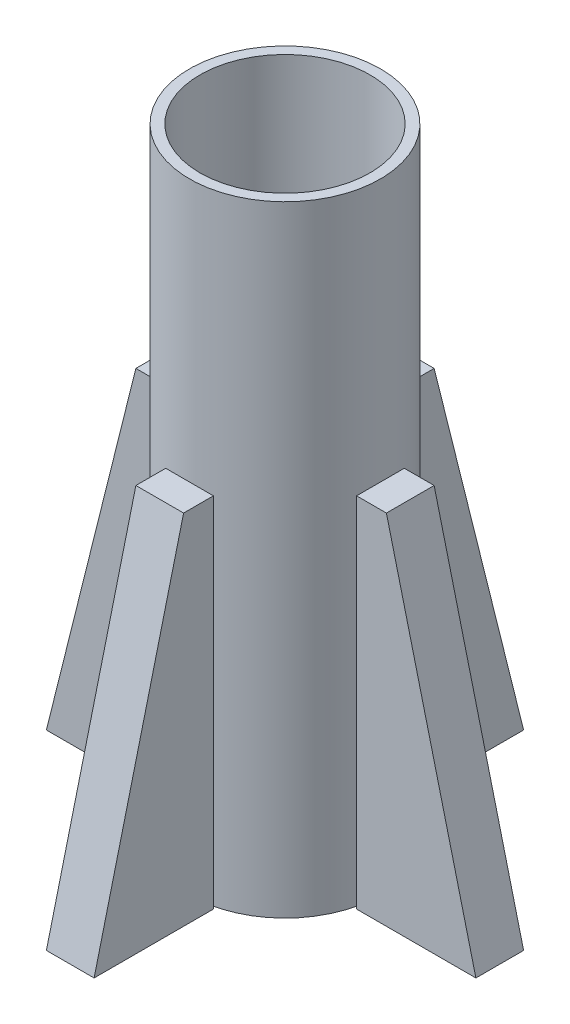
ISO-10303-21;
HEADER;
FILE_DESCRIPTION(('STEP AP214'),'2;1');
FILE_NAME('part.step','',(''),(''),'','','');
FILE_SCHEMA(('AUTOMOTIVE_DESIGN { 1 0 10303 214 1 1 1 1 }'));
ENDSEC;
DATA;
#1=APPLICATION_CONTEXT('core data for automotive mechanical design processes');
#2=APPLICATION_PROTOCOL_DEFINITION('international standard','automotive_design',2000,#1);
#3=PRODUCT_CONTEXT('',#1,'mechanical');
#4=PRODUCT('Part','Part','',(#3));
#5=PRODUCT_RELATED_PRODUCT_CATEGORY('part','',(#4));
#6=PRODUCT_DEFINITION_FORMATION('','',#4);
#7=PRODUCT_DEFINITION_CONTEXT('part definition',#1,'design');
#8=PRODUCT_DEFINITION('design','',#6,#7);
#9=PRODUCT_DEFINITION_SHAPE('','',#8);
#10=(LENGTH_UNIT() NAMED_UNIT(*) SI_UNIT(.MILLI.,.METRE.));
#11=(NAMED_UNIT(*) PLANE_ANGLE_UNIT() SI_UNIT($,.RADIAN.));
#12=(NAMED_UNIT(*) SI_UNIT($,.STERADIAN.) SOLID_ANGLE_UNIT());
#13=UNCERTAINTY_MEASURE_WITH_UNIT(LENGTH_MEASURE(1.E-05),#10,'distance_accuracy_value','');
#14=(GEOMETRIC_REPRESENTATION_CONTEXT(3) GLOBAL_UNCERTAINTY_ASSIGNED_CONTEXT((#13)) GLOBAL_UNIT_ASSIGNED_CONTEXT((#10,
#11,#12)) REPRESENTATION_CONTEXT('',''));
#15=CARTESIAN_POINT('',(0.,0.,0.));
#16=DIRECTION('',(0.,0.,1.));
#17=DIRECTION('',(1.,0.,0.));
#18=AXIS2_PLACEMENT_3D('',#15,#16,#17);
#19=CARTESIAN_POINT('',(-10.5,30.,-2.));
#20=DIRECTION('',(0.,1.,0.));
#21=DIRECTION('',(-1.,0.,0.));
#22=AXIS2_PLACEMENT_3D('',#19,#20,#21);
#23=PLANE('',#22);
#24=DIRECTION('',(0.,0.,1.));
#25=VECTOR('',#24,1.);
#26=CARTESIAN_POINT('',(-10.5,30.,-2.));
#27=LINE('',#26,#25);
#28=CARTESIAN_POINT('',(-10.5,30.,-2.));
#29=VERTEX_POINT('',#28);
#30=CARTESIAN_POINT('',(-10.5,30.,2.));
#31=VERTEX_POINT('',#30);
#32=EDGE_CURVE('E49',#29,#31,#27,.T.);
#33=ORIENTED_EDGE('',*,*,#32,.T.);
#34=DIRECTION('',(-1.,0.,0.));
#35=VECTOR('',#34,1.);
#36=CARTESIAN_POINT('',(-10.5,30.,2.));
#37=LINE('',#36,#35);
#38=CARTESIAN_POINT('',(-8.,30.,2.));
#39=VERTEX_POINT('',#38);
#40=EDGE_CURVE('E86',#39,#31,#37,.T.);
#41=ORIENTED_EDGE('',*,*,#40,.F.);
#42=DIRECTION('',(0.,0.,1.));
#43=VECTOR('',#42,1.);
#44=CARTESIAN_POINT('',(-8.,30.,-2.));
#45=LINE('',#44,#43);
#46=CARTESIAN_POINT('',(-8.,30.,-2.));
#47=VERTEX_POINT('',#46);
#48=EDGE_CURVE('E12',#47,#39,#45,.T.);
#49=ORIENTED_EDGE('',*,*,#48,.F.);
#50=DIRECTION('',(-1.,0.,0.));
#51=VECTOR('',#50,1.);
#52=CARTESIAN_POINT('',(-10.5,30.,-2.));
#53=LINE('',#52,#51);
#54=EDGE_CURVE('E87',#47,#29,#53,.T.);
#55=ORIENTED_EDGE('',*,*,#54,.T.);
#56=EDGE_LOOP('',(#33,#41,#49,#55));
#57=FACE_BOUND('',#56,.T.);
#58=ADVANCED_FACE('F46',(#57),#23,.T.);
#59=CARTESIAN_POINT('',(-8.,30.,-2.));
#60=DIRECTION('',(1.,0.,0.));
#61=DIRECTION('',(0.,0.,-1.));
#62=AXIS2_PLACEMENT_3D('',#59,#60,#61);
#63=PLANE('',#62);
#64=ORIENTED_EDGE('',*,*,#48,.T.);
#65=DIRECTION('',(0.,1.,0.));
#66=VECTOR('',#65,1.);
#67=CARTESIAN_POINT('',(-8.,30.,2.));
#68=LINE('',#67,#66);
#69=CARTESIAN_POINT('',(-8.,0.,2.));
#70=VERTEX_POINT('',#69);
#71=EDGE_CURVE('E103',#70,#39,#68,.T.);
#72=ORIENTED_EDGE('',*,*,#71,.F.);
#73=DIRECTION('',(0.,0.,1.));
#74=VECTOR('',#73,1.);
#75=CARTESIAN_POINT('',(-8.,0.,-2.));
#76=LINE('',#75,#74);
#77=CARTESIAN_POINT('',(-8.,0.,-2.));
#78=VERTEX_POINT('',#77);
#79=EDGE_CURVE('E54',#78,#70,#76,.T.);
#80=ORIENTED_EDGE('',*,*,#79,.F.);
#81=DIRECTION('',(0.,1.,0.));
#82=VECTOR('',#81,1.);
#83=CARTESIAN_POINT('',(-8.,30.,-2.));
#84=LINE('',#83,#82);
#85=EDGE_CURVE('E92',#78,#47,#84,.T.);
#86=ORIENTED_EDGE('',*,*,#85,.T.);
#87=EDGE_LOOP('',(#64,#72,#80,#86));
#88=FACE_BOUND('',#87,.T.);
#89=ADVANCED_FACE('F118',(#88),#63,.T.);
#90=CARTESIAN_POINT('',(-8.,0.,-2.));
#91=DIRECTION('',(0.,-1.,0.));
#92=DIRECTION('',(1.,0.,0.));
#93=AXIS2_PLACEMENT_3D('',#90,#91,#92);
#94=PLANE('',#93);
#95=ORIENTED_EDGE('',*,*,#79,.T.);
#96=DIRECTION('',(1.,0.,0.));
#97=VECTOR('',#96,1.);
#98=CARTESIAN_POINT('',(-8.,0.,2.));
#99=LINE('',#98,#97);
#100=CARTESIAN_POINT('',(-18.,0.,2.));
#101=VERTEX_POINT('',#100);
#102=EDGE_CURVE('E99',#101,#70,#99,.T.);
#103=ORIENTED_EDGE('',*,*,#102,.F.);
#104=DIRECTION('',(0.,0.,1.));
#105=VECTOR('',#104,1.);
#106=CARTESIAN_POINT('',(-18.,0.,-2.));
#107=LINE('',#106,#105);
#108=CARTESIAN_POINT('',(-18.,0.,-2.));
#109=VERTEX_POINT('',#108);
#110=EDGE_CURVE('E91',#109,#101,#107,.T.);
#111=ORIENTED_EDGE('',*,*,#110,.F.);
#112=DIRECTION('',(1.,0.,0.));
#113=VECTOR('',#112,1.);
#114=CARTESIAN_POINT('',(-8.,0.,-2.));
#115=LINE('',#114,#113);
#116=EDGE_CURVE('E111',#109,#78,#115,.T.);
#117=ORIENTED_EDGE('',*,*,#116,.T.);
#118=EDGE_LOOP('',(#95,#103,#111,#117));
#119=FACE_BOUND('',#118,.T.);
#120=ADVANCED_FACE('F115',(#119),#94,.T.);
#121=CARTESIAN_POINT('',(-18.,0.,-2.));
#122=DIRECTION('',(-0.970142500145332,0.242535625036333,0.));
#123=DIRECTION('',(-0.242535625036333,-0.970142500145332,0.));
#124=AXIS2_PLACEMENT_3D('',#121,#122,#123);
#125=PLANE('',#124);
#126=ORIENTED_EDGE('',*,*,#110,.T.);
#127=DIRECTION('',(-0.242535625036333,-0.970142500145332,0.));
#128=VECTOR('',#127,1.);
#129=CARTESIAN_POINT('',(-18.,0.,2.));
#130=LINE('',#129,#128);
#131=EDGE_CURVE('E94',#31,#101,#130,.T.);
#132=ORIENTED_EDGE('',*,*,#131,.F.);
#133=ORIENTED_EDGE('',*,*,#32,.F.);
#134=DIRECTION('',(-0.242535625036333,-0.970142500145332,0.));
#135=VECTOR('',#134,1.);
#136=CARTESIAN_POINT('',(-18.,0.,-2.));
#137=LINE('',#136,#135);
#138=EDGE_CURVE('E109',#29,#109,#137,.T.);
#139=ORIENTED_EDGE('',*,*,#138,.T.);
#140=EDGE_LOOP('',(#126,#132,#133,#139));
#141=FACE_BOUND('',#140,.T.);
#142=ADVANCED_FACE('F95',(#141),#125,.T.);
#143=CARTESIAN_POINT('',(0.,0.,-2.));
#144=DIRECTION('',(0.,0.,-1.));
#145=DIRECTION('',(-1.,0.,0.));
#146=AXIS2_PLACEMENT_3D('',#143,#144,#145);
#147=PLANE('',#146);
#148=ORIENTED_EDGE('',*,*,#54,.F.);
#149=ORIENTED_EDGE('',*,*,#85,.F.);
#150=ORIENTED_EDGE('',*,*,#116,.F.);
#151=ORIENTED_EDGE('',*,*,#138,.F.);
#152=EDGE_LOOP('',(#148,#149,#150,#151));
#153=FACE_BOUND('',#152,.T.);
#154=ADVANCED_FACE('F120',(#153),#147,.T.);
#155=CARTESIAN_POINT('',(0.,0.,2.));
#156=DIRECTION('',(0.,0.,-1.));
#157=DIRECTION('',(-1.,0.,0.));
#158=AXIS2_PLACEMENT_3D('',#155,#156,#157);
#159=PLANE('',#158);
#160=ORIENTED_EDGE('',*,*,#40,.T.);
#161=ORIENTED_EDGE('',*,*,#131,.T.);
#162=ORIENTED_EDGE('',*,*,#102,.T.);
#163=ORIENTED_EDGE('',*,*,#71,.T.);
#164=EDGE_LOOP('',(#160,#161,#162,#163));
#165=FACE_BOUND('',#164,.T.);
#166=ADVANCED_FACE('F102',(#165),#159,.F.);
#167=CLOSED_SHELL('',(#58,#89,#120,#142,#154,#166));
#168=MANIFOLD_SOLID_BREP('B2',#167);
#169=CARTESIAN_POINT('',(8.,0.,-2.));
#170=DIRECTION('',(-1.,0.,0.));
#171=DIRECTION('',(0.,0.,1.));
#172=AXIS2_PLACEMENT_3D('',#169,#170,#171);
#173=PLANE('',#172);
#174=DIRECTION('',(0.,0.,1.));
#175=VECTOR('',#174,1.);
#176=CARTESIAN_POINT('',(8.,0.,-2.));
#177=LINE('',#176,#175);
#178=CARTESIAN_POINT('',(8.,0.,-2.));
#179=VERTEX_POINT('',#178);
#180=CARTESIAN_POINT('',(8.,0.,2.));
#181=VERTEX_POINT('',#180);
#182=EDGE_CURVE('E183',#179,#181,#177,.T.);
#183=ORIENTED_EDGE('',*,*,#182,.T.);
#184=DIRECTION('',(0.,-1.,0.));
#185=VECTOR('',#184,1.);
#186=CARTESIAN_POINT('',(8.,0.,2.));
#187=LINE('',#186,#185);
#188=CARTESIAN_POINT('',(8.,30.,2.));
#189=VERTEX_POINT('',#188);
#190=EDGE_CURVE('E220',#189,#181,#187,.T.);
#191=ORIENTED_EDGE('',*,*,#190,.F.);
#192=DIRECTION('',(0.,0.,1.));
#193=VECTOR('',#192,1.);
#194=CARTESIAN_POINT('',(8.,30.,-2.));
#195=LINE('',#194,#193);
#196=CARTESIAN_POINT('',(8.,30.,-2.));
#197=VERTEX_POINT('',#196);
#198=EDGE_CURVE('E44',#197,#189,#195,.T.);
#199=ORIENTED_EDGE('',*,*,#198,.F.);
#200=DIRECTION('',(0.,-1.,0.));
#201=VECTOR('',#200,1.);
#202=CARTESIAN_POINT('',(8.,0.,-2.));
#203=LINE('',#202,#201);
#204=EDGE_CURVE('E221',#197,#179,#203,.T.);
#205=ORIENTED_EDGE('',*,*,#204,.T.);
#206=EDGE_LOOP('',(#183,#191,#199,#205));
#207=FACE_BOUND('',#206,.T.);
#208=ADVANCED_FACE('F180',(#207),#173,.T.);
#209=CARTESIAN_POINT('',(8.,30.,-2.));
#210=DIRECTION('',(0.,1.,0.));
#211=DIRECTION('',(0.,0.,1.));
#212=AXIS2_PLACEMENT_3D('',#209,#210,#211);
#213=PLANE('',#212);
#214=ORIENTED_EDGE('',*,*,#198,.T.);
#215=DIRECTION('',(-1.,0.,0.));
#216=VECTOR('',#215,1.);
#217=CARTESIAN_POINT('',(8.,30.,2.));
#218=LINE('',#217,#216);
#219=CARTESIAN_POINT('',(10.5,30.,2.));
#220=VERTEX_POINT('',#219);
#221=EDGE_CURVE('E237',#220,#189,#218,.T.);
#222=ORIENTED_EDGE('',*,*,#221,.F.);
#223=DIRECTION('',(0.,0.,1.));
#224=VECTOR('',#223,1.);
#225=CARTESIAN_POINT('',(10.5,30.,-2.));
#226=LINE('',#225,#224);
#227=CARTESIAN_POINT('',(10.5,30.,-2.));
#228=VERTEX_POINT('',#227);
#229=EDGE_CURVE('E188',#228,#220,#226,.T.);
#230=ORIENTED_EDGE('',*,*,#229,.F.);
#231=DIRECTION('',(-1.,0.,0.));
#232=VECTOR('',#231,1.);
#233=CARTESIAN_POINT('',(8.,30.,-2.));
#234=LINE('',#233,#232);
#235=EDGE_CURVE('E226',#228,#197,#234,.T.);
#236=ORIENTED_EDGE('',*,*,#235,.T.);
#237=EDGE_LOOP('',(#214,#222,#230,#236));
#238=FACE_BOUND('',#237,.T.);
#239=ADVANCED_FACE('F252',(#238),#213,.T.);
#240=CARTESIAN_POINT('',(10.5,30.,-2.));
#241=DIRECTION('',(0.970142500145332,0.242535625036333,0.));
#242=DIRECTION('',(-0.242535625036333,0.970142500145332,0.));
#243=AXIS2_PLACEMENT_3D('',#240,#241,#242);
#244=PLANE('',#243);
#245=ORIENTED_EDGE('',*,*,#229,.T.);
#246=DIRECTION('',(-0.242535625036333,0.970142500145332,0.));
#247=VECTOR('',#246,1.);
#248=CARTESIAN_POINT('',(10.5,30.,2.));
#249=LINE('',#248,#247);
#250=CARTESIAN_POINT('',(18.,0.,2.));
#251=VERTEX_POINT('',#250);
#252=EDGE_CURVE('E233',#251,#220,#249,.T.);
#253=ORIENTED_EDGE('',*,*,#252,.F.);
#254=DIRECTION('',(0.,0.,1.));
#255=VECTOR('',#254,1.);
#256=CARTESIAN_POINT('',(18.,0.,-2.));
#257=LINE('',#256,#255);
#258=CARTESIAN_POINT('',(18.,0.,-2.));
#259=VERTEX_POINT('',#258);
#260=EDGE_CURVE('E225',#259,#251,#257,.T.);
#261=ORIENTED_EDGE('',*,*,#260,.F.);
#262=DIRECTION('',(-0.242535625036333,0.970142500145332,0.));
#263=VECTOR('',#262,1.);
#264=CARTESIAN_POINT('',(10.5,30.,-2.));
#265=LINE('',#264,#263);
#266=EDGE_CURVE('E245',#259,#228,#265,.T.);
#267=ORIENTED_EDGE('',*,*,#266,.T.);
#268=EDGE_LOOP('',(#245,#253,#261,#267));
#269=FACE_BOUND('',#268,.T.);
#270=ADVANCED_FACE('F249',(#269),#244,.T.);
#271=CARTESIAN_POINT('',(18.,0.,-2.));
#272=DIRECTION('',(0.,-1.,0.));
#273=DIRECTION('',(1.,0.,0.));
#274=AXIS2_PLACEMENT_3D('',#271,#272,#273);
#275=PLANE('',#274);
#276=ORIENTED_EDGE('',*,*,#260,.T.);
#277=DIRECTION('',(1.,0.,0.));
#278=VECTOR('',#277,1.);
#279=CARTESIAN_POINT('',(18.,0.,2.));
#280=LINE('',#279,#278);
#281=EDGE_CURVE('E228',#181,#251,#280,.T.);
#282=ORIENTED_EDGE('',*,*,#281,.F.);
#283=ORIENTED_EDGE('',*,*,#182,.F.);
#284=DIRECTION('',(1.,0.,0.));
#285=VECTOR('',#284,1.);
#286=CARTESIAN_POINT('',(18.,0.,-2.));
#287=LINE('',#286,#285);
#288=EDGE_CURVE('E243',#179,#259,#287,.T.);
#289=ORIENTED_EDGE('',*,*,#288,.T.);
#290=EDGE_LOOP('',(#276,#282,#283,#289));
#291=FACE_BOUND('',#290,.T.);
#292=ADVANCED_FACE('F229',(#291),#275,.T.);
#293=CARTESIAN_POINT('',(0.,0.,-2.));
#294=DIRECTION('',(0.,0.,-1.));
#295=DIRECTION('',(-1.,0.,0.));
#296=AXIS2_PLACEMENT_3D('',#293,#294,#295);
#297=PLANE('',#296);
#298=ORIENTED_EDGE('',*,*,#204,.F.);
#299=ORIENTED_EDGE('',*,*,#235,.F.);
#300=ORIENTED_EDGE('',*,*,#266,.F.);
#301=ORIENTED_EDGE('',*,*,#288,.F.);
#302=EDGE_LOOP('',(#298,#299,#300,#301));
#303=FACE_BOUND('',#302,.T.);
#304=ADVANCED_FACE('F254',(#303),#297,.T.);
#305=CARTESIAN_POINT('',(0.,0.,2.));
#306=DIRECTION('',(0.,0.,-1.));
#307=DIRECTION('',(-1.,0.,0.));
#308=AXIS2_PLACEMENT_3D('',#305,#306,#307);
#309=PLANE('',#308);
#310=ORIENTED_EDGE('',*,*,#190,.T.);
#311=ORIENTED_EDGE('',*,*,#281,.T.);
#312=ORIENTED_EDGE('',*,*,#252,.T.);
#313=ORIENTED_EDGE('',*,*,#221,.T.);
#314=EDGE_LOOP('',(#310,#311,#312,#313));
#315=FACE_BOUND('',#314,.T.);
#316=ADVANCED_FACE('F236',(#315),#309,.F.);
#317=CLOSED_SHELL('',(#208,#239,#270,#292,#304,#316));
#318=MANIFOLD_SOLID_BREP('B6',#317);
#319=CARTESIAN_POINT('',(-2.,30.,-8.));
#320=DIRECTION('',(0.,0.,1.));
#321=DIRECTION('',(1.,0.,0.));
#322=AXIS2_PLACEMENT_3D('',#319,#320,#321);
#323=PLANE('',#322);
#324=DIRECTION('',(1.,0.,0.));
#325=VECTOR('',#324,1.);
#326=CARTESIAN_POINT('',(-2.,0.,-8.));
#327=LINE('',#326,#325);
#328=CARTESIAN_POINT('',(-2.,0.,-8.));
#329=VERTEX_POINT('',#328);
#330=CARTESIAN_POINT('',(2.,0.,-8.));
#331=VERTEX_POINT('',#330);
#332=EDGE_CURVE('E317',#329,#331,#327,.T.);
#333=ORIENTED_EDGE('',*,*,#332,.T.);
#334=DIRECTION('',(0.,-1.,0.));
#335=VECTOR('',#334,1.);
#336=CARTESIAN_POINT('',(2.,30.,-8.));
#337=LINE('',#336,#335);
#338=CARTESIAN_POINT('',(2.,30.,-8.));
#339=VERTEX_POINT('',#338);
#340=EDGE_CURVE('E354',#339,#331,#337,.T.);
#341=ORIENTED_EDGE('',*,*,#340,.F.);
#342=DIRECTION('',(1.,0.,0.));
#343=VECTOR('',#342,1.);
#344=CARTESIAN_POINT('',(-2.,30.,-8.));
#345=LINE('',#344,#343);
#346=CARTESIAN_POINT('',(-2.,30.,-8.));
#347=VERTEX_POINT('',#346);
#348=EDGE_CURVE('E178',#347,#339,#345,.T.);
#349=ORIENTED_EDGE('',*,*,#348,.F.);
#350=DIRECTION('',(0.,-1.,0.));
#351=VECTOR('',#350,1.);
#352=CARTESIAN_POINT('',(-2.,30.,-8.));
#353=LINE('',#352,#351);
#354=EDGE_CURVE('E355',#347,#329,#353,.T.);
#355=ORIENTED_EDGE('',*,*,#354,.T.);
#356=EDGE_LOOP('',(#333,#341,#349,#355));
#357=FACE_BOUND('',#356,.T.);
#358=ADVANCED_FACE('F314',(#357),#323,.T.);
#359=CARTESIAN_POINT('',(-2.,30.,-10.5));
#360=DIRECTION('',(0.,1.,0.));
#361=DIRECTION('',(0.,0.,1.));
#362=AXIS2_PLACEMENT_3D('',#359,#360,#361);
#363=PLANE('',#362);
#364=ORIENTED_EDGE('',*,*,#348,.T.);
#365=DIRECTION('',(0.,0.,1.));
#366=VECTOR('',#365,1.);
#367=CARTESIAN_POINT('',(2.,30.,-10.5));
#368=LINE('',#367,#366);
#369=CARTESIAN_POINT('',(2.,30.,-10.5));
#370=VERTEX_POINT('',#369);
#371=EDGE_CURVE('E371',#370,#339,#368,.T.);
#372=ORIENTED_EDGE('',*,*,#371,.F.);
#373=DIRECTION('',(1.,0.,0.));
#374=VECTOR('',#373,1.);
#375=CARTESIAN_POINT('',(-2.,30.,-10.5));
#376=LINE('',#375,#374);
#377=CARTESIAN_POINT('',(-2.,30.,-10.5));
#378=VERTEX_POINT('',#377);
#379=EDGE_CURVE('E322',#378,#370,#376,.T.);
#380=ORIENTED_EDGE('',*,*,#379,.F.);
#381=DIRECTION('',(0.,0.,1.));
#382=VECTOR('',#381,1.);
#383=CARTESIAN_POINT('',(-2.,30.,-10.5));
#384=LINE('',#383,#382);
#385=EDGE_CURVE('E360',#378,#347,#384,.T.);
#386=ORIENTED_EDGE('',*,*,#385,.T.);
#387=EDGE_LOOP('',(#364,#372,#380,#386));
#388=FACE_BOUND('',#387,.T.);
#389=ADVANCED_FACE('F386',(#388),#363,.T.);
#390=CARTESIAN_POINT('',(-2.,0.,-18.));
#391=DIRECTION('',(0.,0.242535625036333,-0.970142500145332));
#392=DIRECTION('',(0.,0.970142500145332,0.242535625036333));
#393=AXIS2_PLACEMENT_3D('',#390,#391,#392);
#394=PLANE('',#393);
#395=ORIENTED_EDGE('',*,*,#379,.T.);
#396=DIRECTION('',(0.,0.970142500145332,0.242535625036333));
#397=VECTOR('',#396,1.);
#398=CARTESIAN_POINT('',(2.,0.,-18.));
#399=LINE('',#398,#397);
#400=CARTESIAN_POINT('',(2.,0.,-18.));
#401=VERTEX_POINT('',#400);
#402=EDGE_CURVE('E367',#401,#370,#399,.T.);
#403=ORIENTED_EDGE('',*,*,#402,.F.);
#404=DIRECTION('',(1.,0.,0.));
#405=VECTOR('',#404,1.);
#406=CARTESIAN_POINT('',(-2.,0.,-18.));
#407=LINE('',#406,#405);
#408=CARTESIAN_POINT('',(-2.,0.,-18.));
#409=VERTEX_POINT('',#408);
#410=EDGE_CURVE('E359',#409,#401,#407,.T.);
#411=ORIENTED_EDGE('',*,*,#410,.F.);
#412=DIRECTION('',(0.,0.970142500145332,0.242535625036333));
#413=VECTOR('',#412,1.);
#414=CARTESIAN_POINT('',(-2.,0.,-18.));
#415=LINE('',#414,#413);
#416=EDGE_CURVE('E379',#409,#378,#415,.T.);
#417=ORIENTED_EDGE('',*,*,#416,.T.);
#418=EDGE_LOOP('',(#395,#403,#411,#417));
#419=FACE_BOUND('',#418,.T.);
#420=ADVANCED_FACE('F383',(#419),#394,.T.);
#421=CARTESIAN_POINT('',(-2.,0.,-8.));
#422=DIRECTION('',(0.,-1.,0.));
#423=DIRECTION('',(0.,0.,-1.));
#424=AXIS2_PLACEMENT_3D('',#421,#422,#423);
#425=PLANE('',#424);
#426=ORIENTED_EDGE('',*,*,#410,.T.);
#427=DIRECTION('',(0.,0.,-1.));
#428=VECTOR('',#427,1.);
#429=CARTESIAN_POINT('',(2.,0.,-8.));
#430=LINE('',#429,#428);
#431=EDGE_CURVE('E362',#331,#401,#430,.T.);
#432=ORIENTED_EDGE('',*,*,#431,.F.);
#433=ORIENTED_EDGE('',*,*,#332,.F.);
#434=DIRECTION('',(0.,0.,-1.));
#435=VECTOR('',#434,1.);
#436=CARTESIAN_POINT('',(-2.,0.,-8.));
#437=LINE('',#436,#435);
#438=EDGE_CURVE('E377',#329,#409,#437,.T.);
#439=ORIENTED_EDGE('',*,*,#438,.T.);
#440=EDGE_LOOP('',(#426,#432,#433,#439));
#441=FACE_BOUND('',#440,.T.);
#442=ADVANCED_FACE('F363',(#441),#425,.T.);
#443=CARTESIAN_POINT('',(-2.,0.,0.));
#444=DIRECTION('',(1.,0.,0.));
#445=DIRECTION('',(0.,0.,-1.));
#446=AXIS2_PLACEMENT_3D('',#443,#444,#445);
#447=PLANE('',#446);
#448=ORIENTED_EDGE('',*,*,#354,.F.);
#449=ORIENTED_EDGE('',*,*,#385,.F.);
#450=ORIENTED_EDGE('',*,*,#416,.F.);
#451=ORIENTED_EDGE('',*,*,#438,.F.);
#452=EDGE_LOOP('',(#448,#449,#450,#451));
#453=FACE_BOUND('',#452,.T.);
#454=ADVANCED_FACE('F388',(#453),#447,.F.);
#455=CARTESIAN_POINT('',(2.,0.,0.));
#456=DIRECTION('',(1.,0.,0.));
#457=DIRECTION('',(0.,0.,-1.));
#458=AXIS2_PLACEMENT_3D('',#455,#456,#457);
#459=PLANE('',#458);
#460=ORIENTED_EDGE('',*,*,#340,.T.);
#461=ORIENTED_EDGE('',*,*,#431,.T.);
#462=ORIENTED_EDGE('',*,*,#402,.T.);
#463=ORIENTED_EDGE('',*,*,#371,.T.);
#464=EDGE_LOOP('',(#460,#461,#462,#463));
#465=FACE_BOUND('',#464,.T.);
#466=ADVANCED_FACE('F370',(#465),#459,.T.);
#467=CLOSED_SHELL('',(#358,#389,#420,#442,#454,#466));
#468=MANIFOLD_SOLID_BREP('B38',#467);
#469=CARTESIAN_POINT('',(-2.,0.,8.));
#470=DIRECTION('',(0.,0.,-1.));
#471=DIRECTION('',(-1.,0.,0.));
#472=AXIS2_PLACEMENT_3D('',#469,#470,#471);
#473=PLANE('',#472);
#474=DIRECTION('',(1.,0.,0.));
#475=VECTOR('',#474,1.);
#476=CARTESIAN_POINT('',(-2.,30.,8.));
#477=LINE('',#476,#475);
#478=CARTESIAN_POINT('',(-2.,30.,8.));
#479=VERTEX_POINT('',#478);
#480=CARTESIAN_POINT('',(2.,30.,8.));
#481=VERTEX_POINT('',#480);
#482=EDGE_CURVE('E448',#479,#481,#477,.T.);
#483=ORIENTED_EDGE('',*,*,#482,.T.);
#484=DIRECTION('',(0.,1.,0.));
#485=VECTOR('',#484,1.);
#486=CARTESIAN_POINT('',(2.,0.,8.));
#487=LINE('',#486,#485);
#488=CARTESIAN_POINT('',(2.,0.,8.));
#489=VERTEX_POINT('',#488);
#490=EDGE_CURVE('E485',#489,#481,#487,.T.);
#491=ORIENTED_EDGE('',*,*,#490,.F.);
#492=DIRECTION('',(1.,0.,0.));
#493=VECTOR('',#492,1.);
#494=CARTESIAN_POINT('',(-2.,0.,8.));
#495=LINE('',#494,#493);
#496=CARTESIAN_POINT('',(-2.,0.,8.));
#497=VERTEX_POINT('',#496);
#498=EDGE_CURVE('E312',#497,#489,#495,.T.);
#499=ORIENTED_EDGE('',*,*,#498,.F.);
#500=DIRECTION('',(0.,1.,0.));
#501=VECTOR('',#500,1.);
#502=CARTESIAN_POINT('',(-2.,0.,8.));
#503=LINE('',#502,#501);
#504=EDGE_CURVE('E486',#497,#479,#503,.T.);
#505=ORIENTED_EDGE('',*,*,#504,.T.);
#506=EDGE_LOOP('',(#483,#491,#499,#505));
#507=FACE_BOUND('',#506,.T.);
#508=ADVANCED_FACE('F445',(#507),#473,.T.);
#509=CARTESIAN_POINT('',(-2.,0.,18.));
#510=DIRECTION('',(0.,-1.,0.));
#511=DIRECTION('',(0.,0.,-1.));
#512=AXIS2_PLACEMENT_3D('',#509,#510,#511);
#513=PLANE('',#512);
#514=ORIENTED_EDGE('',*,*,#498,.T.);
#515=DIRECTION('',(0.,0.,-1.));
#516=VECTOR('',#515,1.);
#517=CARTESIAN_POINT('',(2.,0.,18.));
#518=LINE('',#517,#516);
#519=CARTESIAN_POINT('',(2.,0.,18.));
#520=VERTEX_POINT('',#519);
#521=EDGE_CURVE('E502',#520,#489,#518,.T.);
#522=ORIENTED_EDGE('',*,*,#521,.F.);
#523=DIRECTION('',(1.,0.,0.));
#524=VECTOR('',#523,1.);
#525=CARTESIAN_POINT('',(-2.,0.,18.));
#526=LINE('',#525,#524);
#527=CARTESIAN_POINT('',(-2.,0.,18.));
#528=VERTEX_POINT('',#527);
#529=EDGE_CURVE('E453',#528,#520,#526,.T.);
#530=ORIENTED_EDGE('',*,*,#529,.F.);
#531=DIRECTION('',(0.,0.,-1.));
#532=VECTOR('',#531,1.);
#533=CARTESIAN_POINT('',(-2.,0.,18.));
#534=LINE('',#533,#532);
#535=EDGE_CURVE('E491',#528,#497,#534,.T.);
#536=ORIENTED_EDGE('',*,*,#535,.T.);
#537=EDGE_LOOP('',(#514,#522,#530,#536));
#538=FACE_BOUND('',#537,.T.);
#539=ADVANCED_FACE('F517',(#538),#513,.T.);
#540=CARTESIAN_POINT('',(-2.,30.,10.5));
#541=DIRECTION('',(0.,0.242535625036333,0.970142500145332));
#542=DIRECTION('',(0.,-0.970142500145332,0.242535625036333));
#543=AXIS2_PLACEMENT_3D('',#540,#541,#542);
#544=PLANE('',#543);
#545=ORIENTED_EDGE('',*,*,#529,.T.);
#546=DIRECTION('',(0.,-0.970142500145332,0.242535625036333));
#547=VECTOR('',#546,1.);
#548=CARTESIAN_POINT('',(2.,30.,10.5));
#549=LINE('',#548,#547);
#550=CARTESIAN_POINT('',(2.,30.,10.5));
#551=VERTEX_POINT('',#550);
#552=EDGE_CURVE('E498',#551,#520,#549,.T.);
#553=ORIENTED_EDGE('',*,*,#552,.F.);
#554=DIRECTION('',(1.,0.,0.));
#555=VECTOR('',#554,1.);
#556=CARTESIAN_POINT('',(-2.,30.,10.5));
#557=LINE('',#556,#555);
#558=CARTESIAN_POINT('',(-2.,30.,10.5));
#559=VERTEX_POINT('',#558);
#560=EDGE_CURVE('E490',#559,#551,#557,.T.);
#561=ORIENTED_EDGE('',*,*,#560,.F.);
#562=DIRECTION('',(0.,-0.970142500145332,0.242535625036333));
#563=VECTOR('',#562,1.);
#564=CARTESIAN_POINT('',(-2.,30.,10.5));
#565=LINE('',#564,#563);
#566=EDGE_CURVE('E510',#559,#528,#565,.T.);
#567=ORIENTED_EDGE('',*,*,#566,.T.);
#568=EDGE_LOOP('',(#545,#553,#561,#567));
#569=FACE_BOUND('',#568,.T.);
#570=ADVANCED_FACE('F514',(#569),#544,.T.);
#571=CARTESIAN_POINT('',(-2.,30.,8.));
#572=DIRECTION('',(0.,1.,0.));
#573=DIRECTION('',(0.,0.,1.));
#574=AXIS2_PLACEMENT_3D('',#571,#572,#573);
#575=PLANE('',#574);
#576=ORIENTED_EDGE('',*,*,#560,.T.);
#577=DIRECTION('',(0.,0.,1.));
#578=VECTOR('',#577,1.);
#579=CARTESIAN_POINT('',(2.,30.,8.));
#580=LINE('',#579,#578);
#581=EDGE_CURVE('E493',#481,#551,#580,.T.);
#582=ORIENTED_EDGE('',*,*,#581,.F.);
#583=ORIENTED_EDGE('',*,*,#482,.F.);
#584=DIRECTION('',(0.,0.,1.));
#585=VECTOR('',#584,1.);
#586=CARTESIAN_POINT('',(-2.,30.,8.));
#587=LINE('',#586,#585);
#588=EDGE_CURVE('E508',#479,#559,#587,.T.);
#589=ORIENTED_EDGE('',*,*,#588,.T.);
#590=EDGE_LOOP('',(#576,#582,#583,#589));
#591=FACE_BOUND('',#590,.T.);
#592=ADVANCED_FACE('F494',(#591),#575,.T.);
#593=CARTESIAN_POINT('',(-2.,0.,0.));
#594=DIRECTION('',(1.,0.,0.));
#595=DIRECTION('',(0.,0.,-1.));
#596=AXIS2_PLACEMENT_3D('',#593,#594,#595);
#597=PLANE('',#596);
#598=ORIENTED_EDGE('',*,*,#504,.F.);
#599=ORIENTED_EDGE('',*,*,#535,.F.);
#600=ORIENTED_EDGE('',*,*,#566,.F.);
#601=ORIENTED_EDGE('',*,*,#588,.F.);
#602=EDGE_LOOP('',(#598,#599,#600,#601));
#603=FACE_BOUND('',#602,.T.);
#604=ADVANCED_FACE('F519',(#603),#597,.F.);
#605=CARTESIAN_POINT('',(2.,0.,0.));
#606=DIRECTION('',(1.,0.,0.));
#607=DIRECTION('',(0.,0.,-1.));
#608=AXIS2_PLACEMENT_3D('',#605,#606,#607);
#609=PLANE('',#608);
#610=ORIENTED_EDGE('',*,*,#490,.T.);
#611=ORIENTED_EDGE('',*,*,#581,.T.);
#612=ORIENTED_EDGE('',*,*,#552,.T.);
#613=ORIENTED_EDGE('',*,*,#521,.T.);
#614=EDGE_LOOP('',(#610,#611,#612,#613));
#615=FACE_BOUND('',#614,.T.);
#616=ADVANCED_FACE('F501',(#615),#609,.T.);
#617=CLOSED_SHELL('',(#508,#539,#570,#592,#604,#616));
#618=MANIFOLD_SOLID_BREP('B172',#617);
#619=CARTESIAN_POINT('',(0.,52.,0.));
#620=DIRECTION('',(0.,-1.,0.));
#621=DIRECTION('',(0.,0.,-1.));
#622=AXIS2_PLACEMENT_3D('',#619,#620,#621);
#623=CYLINDRICAL_SURFACE('',#622,8.);
#624=CARTESIAN_POINT('',(0.,0.,0.));
#625=DIRECTION('',(0.,1.,0.));
#626=DIRECTION('',(0.,0.,1.));
#627=AXIS2_PLACEMENT_3D('',#624,#625,#626);
#628=CIRCLE('',#627,8.);
#629=CARTESIAN_POINT('',(0.,0.,-8.));
#630=VERTEX_POINT('',#629);
#631=EDGE_CURVE('E572',#630,#630,#628,.T.);
#632=CARTESIAN_POINT('',(0.,52.,0.));
#633=DIRECTION('',(0.,1.,0.));
#634=DIRECTION('',(0.,0.,1.));
#635=AXIS2_PLACEMENT_3D('',#632,#633,#634);
#636=CIRCLE('',#635,8.);
#637=CARTESIAN_POINT('',(0.,52.,-8.));
#638=VERTEX_POINT('',#637);
#639=EDGE_CURVE('E444',#638,#638,#636,.T.);
#640=CARTESIAN_POINT('',(0.,0.,-8.));
#641=CARTESIAN_POINT('',(0.,0.541666666666667,-8.));
#642=CARTESIAN_POINT('',(0.,1.08333333333333,-8.));
#643=CARTESIAN_POINT('',(0.,2.16666666666667,-8.));
#644=CARTESIAN_POINT('',(0.,2.70833333333334,-8.));
#645=CARTESIAN_POINT('',(0.,3.79166666666667,-8.));
#646=CARTESIAN_POINT('',(0.,4.33333333333334,-8.));
#647=CARTESIAN_POINT('',(0.,5.41666666666667,-8.));
#648=CARTESIAN_POINT('',(0.,5.95833333333333,-8.));
#649=CARTESIAN_POINT('',(0.,7.04166666666667,-8.));
#650=CARTESIAN_POINT('',(0.,7.58333333333333,-8.));
#651=CARTESIAN_POINT('',(0.,8.66666666666667,-8.));
#652=CARTESIAN_POINT('',(0.,9.20833333333333,-8.));
#653=CARTESIAN_POINT('',(0.,10.2916666666667,-8.));
#654=CARTESIAN_POINT('',(0.,10.8333333333333,-8.));
#655=CARTESIAN_POINT('',(0.,11.9166666666667,-8.));
#656=CARTESIAN_POINT('',(0.,12.4583333333333,-8.));
#657=CARTESIAN_POINT('',(0.,13.5416666666667,-8.));
#658=CARTESIAN_POINT('',(0.,14.0833333333333,-8.));
#659=CARTESIAN_POINT('',(0.,15.1666666666667,-8.));
#660=CARTESIAN_POINT('',(0.,15.7083333333333,-8.));
#661=CARTESIAN_POINT('',(0.,16.7916666666667,-8.));
#662=CARTESIAN_POINT('',(0.,17.3333333333333,-8.));
#663=CARTESIAN_POINT('',(0.,18.4166666666667,-8.));
#664=CARTESIAN_POINT('',(0.,18.9583333333333,-8.));
#665=CARTESIAN_POINT('',(0.,20.0416666666667,-8.));
#666=CARTESIAN_POINT('',(0.,20.5833333333333,-8.));
#667=CARTESIAN_POINT('',(0.,21.6666666666667,-8.));
#668=CARTESIAN_POINT('',(0.,22.2083333333333,-8.));
#669=CARTESIAN_POINT('',(0.,23.2916666666667,-8.));
#670=CARTESIAN_POINT('',(0.,23.8333333333333,-8.));
#671=CARTESIAN_POINT('',(0.,24.9166666666667,-8.));
#672=CARTESIAN_POINT('',(0.,25.4583333333333,-8.));
#673=CARTESIAN_POINT('',(0.,26.5416666666667,-8.));
#674=CARTESIAN_POINT('',(0.,27.0833333333333,-8.));
#675=CARTESIAN_POINT('',(0.,28.1666666666667,-8.));
#676=CARTESIAN_POINT('',(0.,28.7083333333333,-8.));
#677=CARTESIAN_POINT('',(0.,29.7916666666667,-8.));
#678=CARTESIAN_POINT('',(0.,30.3333333333333,-8.));
#679=CARTESIAN_POINT('',(0.,31.4166666666667,-8.));
#680=CARTESIAN_POINT('',(0.,31.9583333333333,-8.));
#681=CARTESIAN_POINT('',(0.,33.0416666666667,-8.));
#682=CARTESIAN_POINT('',(0.,33.5833333333333,-8.));
#683=CARTESIAN_POINT('',(0.,34.6666666666667,-8.));
#684=CARTESIAN_POINT('',(0.,35.2083333333333,-8.));
#685=CARTESIAN_POINT('',(0.,36.2916666666667,-8.));
#686=CARTESIAN_POINT('',(0.,36.8333333333333,-8.));
#687=CARTESIAN_POINT('',(0.,37.9166666666667,-8.));
#688=CARTESIAN_POINT('',(0.,38.4583333333333,-8.));
#689=CARTESIAN_POINT('',(0.,39.5416666666667,-8.));
#690=CARTESIAN_POINT('',(0.,40.0833333333333,-8.));
#691=CARTESIAN_POINT('',(0.,41.1666666666667,-8.));
#692=CARTESIAN_POINT('',(0.,41.7083333333333,-8.));
#693=CARTESIAN_POINT('',(0.,42.7916666666667,-8.));
#694=CARTESIAN_POINT('',(0.,43.3333333333333,-8.));
#695=CARTESIAN_POINT('',(0.,44.4166666666667,-8.));
#696=CARTESIAN_POINT('',(0.,44.9583333333333,-8.));
#697=CARTESIAN_POINT('',(0.,46.0416666666667,-8.));
#698=CARTESIAN_POINT('',(0.,46.5833333333333,-8.));
#699=CARTESIAN_POINT('',(0.,47.6666666666667,-8.));
#700=CARTESIAN_POINT('',(0.,48.2083333333333,-8.));
#701=CARTESIAN_POINT('',(0.,49.2916666666667,-8.));
#702=CARTESIAN_POINT('',(0.,49.8333333333333,-8.));
#703=CARTESIAN_POINT('',(0.,50.9166666666667,-8.));
#704=CARTESIAN_POINT('',(0.,51.4583333333333,-8.));
#705=CARTESIAN_POINT('',(0.,52.,-8.));
#706=B_SPLINE_CURVE_WITH_KNOTS('',3,(#640,#641,#642,#643,#644,#645,#646,#647,#648,#649,#650,
#651,#652,#653,#654,#655,#656,#657,#658,#659,#660,#661,#662,#663,#664,#665,#666,#667,#668,#669,
#670,#671,#672,#673,#674,#675,#676,#677,#678,#679,#680,#681,#682,#683,#684,#685,#686,#687,#688,
#689,#690,#691,#692,#693,#694,#695,#696,#697,#698,#699,#700,#701,#702,#703,#704,#705),
.UNSPECIFIED.,.F.,.F.,(4,2,2,2,2,2,2,2,2,2,2,2,2,2,2,2,2,2,2,2,2,2,2,2,2,2,2,2,2,2,2,2,4),(0.,
1.625,3.25,4.875,6.5,8.125,9.75,11.375,13.,14.625,16.25,17.875,19.5,21.125,22.75,24.375,26.,
27.625,29.25,30.875,32.5,34.125,35.75,37.375,39.,40.625,42.25,43.875,45.5,47.125,48.75,50.375,
52.),.UNSPECIFIED.);
#707=EDGE_CURVE('BSEAM569',#630,#638,#706,.T.);
#708=ORIENTED_EDGE('',*,*,#631,.T.);
#709=ORIENTED_EDGE('',*,*,#639,.F.);
#710=ORIENTED_EDGE('',*,*,#707,.T.);
#711=ORIENTED_EDGE('',*,*,#707,.F.);
#712=EDGE_LOOP('',(#708,#710,#709,#711));
#713=FACE_BOUND('',#712,.T.);
#714=ADVANCED_FACE('F569',(#713),#623,.T.);
#715=CARTESIAN_POINT('',(0.,52.,0.));
#716=DIRECTION('',(0.,1.,0.));
#717=DIRECTION('',(0.,0.,1.));
#718=AXIS2_PLACEMENT_3D('',#715,#716,#717);
#719=PLANE('',#718);
#720=CARTESIAN_POINT('',(0.,52.,0.));
#721=DIRECTION('',(0.,1.,0.));
#722=DIRECTION('',(0.,0.,1.));
#723=AXIS2_PLACEMENT_3D('',#720,#721,#722);
#724=CIRCLE('',#723,7.125);
#725=CARTESIAN_POINT('',(0.,52.,7.125));
#726=VERTEX_POINT('',#725);
#727=EDGE_CURVE('E581',#726,#726,#724,.T.);
#728=ORIENTED_EDGE('',*,*,#727,.F.);
#729=EDGE_LOOP('',(#728));
#730=FACE_BOUND('',#729,.T.);
#731=ORIENTED_EDGE('',*,*,#639,.T.);
#732=EDGE_LOOP('',(#731));
#733=FACE_BOUND('',#732,.T.);
#734=ADVANCED_FACE('F596',(#730,#733),#719,.T.);
#735=CARTESIAN_POINT('',(0.,0.,0.));
#736=DIRECTION('',(0.,1.,0.));
#737=DIRECTION('',(0.,0.,1.));
#738=AXIS2_PLACEMENT_3D('',#735,#736,#737);
#739=PLANE('',#738);
#740=ORIENTED_EDGE('',*,*,#631,.F.);
#741=EDGE_LOOP('',(#740));
#742=FACE_BOUND('',#741,.T.);
#743=ADVANCED_FACE('F592',(#742),#739,.F.);
#744=CARTESIAN_POINT('',(0.,1.99999999999999,0.));
#745=DIRECTION('',(0.,1.,0.));
#746=DIRECTION('',(0.,0.,1.));
#747=AXIS2_PLACEMENT_3D('',#744,#745,#746);
#748=CYLINDRICAL_SURFACE('',#747,7.125);
#749=CARTESIAN_POINT('',(0.,1.99999999999999,0.));
#750=DIRECTION('',(0.,1.,0.));
#751=DIRECTION('',(0.,0.,1.));
#752=AXIS2_PLACEMENT_3D('',#749,#750,#751);
#753=CIRCLE('',#752,7.125);
#754=CARTESIAN_POINT('',(0.,1.99999999999999,7.125));
#755=VERTEX_POINT('',#754);
#756=EDGE_CURVE('E579',#755,#755,#753,.T.);
#757=ORIENTED_EDGE('',*,*,#756,.F.);
#758=EDGE_LOOP('',(#757));
#759=FACE_BOUND('',#758,.T.);
#760=ORIENTED_EDGE('',*,*,#727,.T.);
#761=EDGE_LOOP('',(#760));
#762=FACE_BOUND('',#761,.T.);
#763=ADVANCED_FACE('F589',(#759,#762),#748,.F.);
#764=CARTESIAN_POINT('',(0.,1.99999999999999,0.));
#765=DIRECTION('',(0.,1.,0.));
#766=DIRECTION('',(0.,0.,1.));
#767=AXIS2_PLACEMENT_3D('',#764,#765,#766);
#768=PLANE('',#767);
#769=ORIENTED_EDGE('',*,*,#756,.T.);
#770=EDGE_LOOP('',(#769));
#771=FACE_BOUND('',#770,.T.);
#772=ADVANCED_FACE('F587',(#771),#768,.T.);
#773=CLOSED_SHELL('',(#714,#734,#743,#763,#772));
#774=MANIFOLD_SOLID_BREP('B306',#773);
#775=ADVANCED_BREP_SHAPE_REPRESENTATION('',(#18,#168,#318,#468,#618,#774),#14);
#776=SHAPE_DEFINITION_REPRESENTATION(#9,#775);
ENDSEC;
END-ISO-10303-21;
